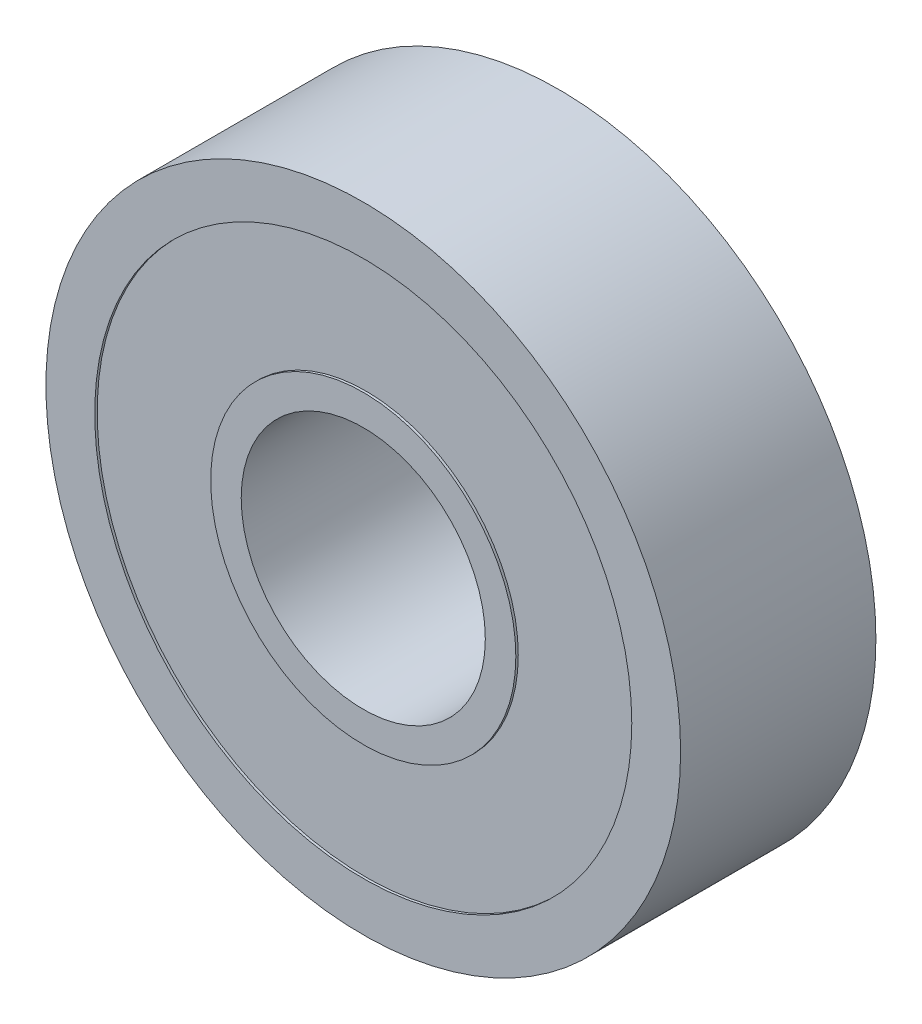
ISO-10303-21;
HEADER;
FILE_DESCRIPTION(('STEP AP214'),'2;1');
FILE_NAME('part.step','',(''),(''),'','','');
FILE_SCHEMA(('AUTOMOTIVE_DESIGN { 1 0 10303 214 1 1 1 1 }'));
ENDSEC;
DATA;
#1=APPLICATION_CONTEXT('core data for automotive mechanical design processes');
#2=APPLICATION_PROTOCOL_DEFINITION('international standard','automotive_design',2000,#1);
#3=PRODUCT_CONTEXT('',#1,'mechanical');
#4=PRODUCT('Part','Part','',(#3));
#5=PRODUCT_RELATED_PRODUCT_CATEGORY('part','',(#4));
#6=PRODUCT_DEFINITION_FORMATION('','',#4);
#7=PRODUCT_DEFINITION_CONTEXT('part definition',#1,'design');
#8=PRODUCT_DEFINITION('design','',#6,#7);
#9=PRODUCT_DEFINITION_SHAPE('','',#8);
#10=(LENGTH_UNIT() NAMED_UNIT(*) SI_UNIT(.MILLI.,.METRE.));
#11=(NAMED_UNIT(*) PLANE_ANGLE_UNIT() SI_UNIT($,.RADIAN.));
#12=(NAMED_UNIT(*) SI_UNIT($,.STERADIAN.) SOLID_ANGLE_UNIT());
#13=UNCERTAINTY_MEASURE_WITH_UNIT(LENGTH_MEASURE(1.E-05),#10,'distance_accuracy_value','');
#14=(GEOMETRIC_REPRESENTATION_CONTEXT(3) GLOBAL_UNCERTAINTY_ASSIGNED_CONTEXT((#13)) GLOBAL_UNIT_ASSIGNED_CONTEXT((#10,
#11,#12)) REPRESENTATION_CONTEXT('',''));
#15=CARTESIAN_POINT('',(0.,0.,0.));
#16=DIRECTION('',(0.,0.,1.));
#17=DIRECTION('',(1.,0.,0.));
#18=AXIS2_PLACEMENT_3D('',#15,#16,#17);
#19=CARTESIAN_POINT('',(0.,0.,0.));
#20=DIRECTION('',(0.,0.,1.));
#21=DIRECTION('',(1.,0.,0.));
#22=AXIS2_PLACEMENT_3D('',#19,#20,#21);
#23=PLANE('',#22);
#24=CARTESIAN_POINT('',(0.,0.,0.));
#25=DIRECTION('',(0.,0.,1.));
#26=DIRECTION('',(1.,0.,0.));
#27=AXIS2_PLACEMENT_3D('',#24,#25,#26);
#28=CIRCLE('',#27,5.);
#29=CARTESIAN_POINT('',(5.,0.,0.));
#30=VERTEX_POINT('',#29);
#31=EDGE_CURVE('E52',#30,#30,#28,.T.);
#32=ORIENTED_EDGE('',*,*,#31,.T.);
#33=EDGE_LOOP('',(#32));
#34=FACE_BOUND('',#33,.T.);
#35=CARTESIAN_POINT('',(0.,0.,0.));
#36=DIRECTION('',(0.,0.,-1.));
#37=DIRECTION('',(-1.,0.,0.));
#38=AXIS2_PLACEMENT_3D('',#35,#36,#37);
#39=CIRCLE('',#38,6.25);
#40=CARTESIAN_POINT('',(-6.25,0.,0.));
#41=VERTEX_POINT('',#40);
#42=EDGE_CURVE('E84',#41,#41,#39,.T.);
#43=ORIENTED_EDGE('',*,*,#42,.T.);
#44=EDGE_LOOP('',(#43));
#45=FACE_BOUND('',#44,.T.);
#46=ADVANCED_FACE('F37',(#34,#45),#23,.F.);
#47=CARTESIAN_POINT('',(0.,0.,8.));
#48=DIRECTION('',(0.,0.,1.));
#49=DIRECTION('',(1.,0.,0.));
#50=AXIS2_PLACEMENT_3D('',#47,#48,#49);
#51=PLANE('',#50);
#52=CARTESIAN_POINT('',(0.,0.,8.));
#53=DIRECTION('',(0.,0.,1.));
#54=DIRECTION('',(1.,0.,0.));
#55=AXIS2_PLACEMENT_3D('',#52,#53,#54);
#56=CIRCLE('',#55,5.);
#57=CARTESIAN_POINT('',(5.,0.,8.));
#58=VERTEX_POINT('',#57);
#59=EDGE_CURVE('E50',#58,#58,#56,.T.);
#60=ORIENTED_EDGE('',*,*,#59,.F.);
#61=EDGE_LOOP('',(#60));
#62=FACE_BOUND('',#61,.T.);
#63=CARTESIAN_POINT('',(0.,0.,8.));
#64=DIRECTION('',(0.,0.,1.));
#65=DIRECTION('',(1.,0.,0.));
#66=AXIS2_PLACEMENT_3D('',#63,#64,#65);
#67=CIRCLE('',#66,6.25);
#68=CARTESIAN_POINT('',(6.25,0.,8.));
#69=VERTEX_POINT('',#68);
#70=EDGE_CURVE('E68',#69,#69,#67,.T.);
#71=ORIENTED_EDGE('',*,*,#70,.T.);
#72=EDGE_LOOP('',(#71));
#73=FACE_BOUND('',#72,.T.);
#74=ADVANCED_FACE('F124',(#62,#73),#51,.T.);
#75=CARTESIAN_POINT('',(0.,0.,8.));
#76=DIRECTION('',(0.,0.,1.));
#77=DIRECTION('',(1.,0.,0.));
#78=AXIS2_PLACEMENT_3D('',#75,#76,#77);
#79=CIRCLE('',#78,11.);
#80=CARTESIAN_POINT('',(11.,0.,8.));
#81=VERTEX_POINT('',#80);
#82=EDGE_CURVE('E60',#81,#81,#79,.T.);
#83=ORIENTED_EDGE('',*,*,#82,.F.);
#84=EDGE_LOOP('',(#83));
#85=FACE_BOUND('',#84,.T.);
#86=CARTESIAN_POINT('',(0.,0.,8.));
#87=DIRECTION('',(0.,0.,1.));
#88=DIRECTION('',(1.,0.,0.));
#89=AXIS2_PLACEMENT_3D('',#86,#87,#88);
#90=CIRCLE('',#89,13.);
#91=CARTESIAN_POINT('',(13.,0.,8.));
#92=VERTEX_POINT('',#91);
#93=EDGE_CURVE('E10',#92,#92,#90,.T.);
#94=ORIENTED_EDGE('',*,*,#93,.T.);
#95=EDGE_LOOP('',(#94));
#96=FACE_BOUND('',#95,.T.);
#97=ADVANCED_FACE('F111',(#85,#96),#51,.T.);
#98=CARTESIAN_POINT('',(0.,0.,0.));
#99=DIRECTION('',(0.,0.,-1.));
#100=DIRECTION('',(-1.,0.,0.));
#101=AXIS2_PLACEMENT_3D('',#98,#99,#100);
#102=CIRCLE('',#101,11.);
#103=CARTESIAN_POINT('',(-11.,0.,0.));
#104=VERTEX_POINT('',#103);
#105=EDGE_CURVE('E76',#104,#104,#102,.T.);
#106=ORIENTED_EDGE('',*,*,#105,.F.);
#107=EDGE_LOOP('',(#106));
#108=FACE_BOUND('',#107,.T.);
#109=CARTESIAN_POINT('',(0.,0.,0.));
#110=DIRECTION('',(0.,0.,1.));
#111=DIRECTION('',(1.,0.,0.));
#112=AXIS2_PLACEMENT_3D('',#109,#110,#111);
#113=CIRCLE('',#112,13.);
#114=CARTESIAN_POINT('',(13.,0.,0.));
#115=VERTEX_POINT('',#114);
#116=EDGE_CURVE('E41',#115,#115,#113,.T.);
#117=ORIENTED_EDGE('',*,*,#116,.F.);
#118=EDGE_LOOP('',(#117));
#119=FACE_BOUND('',#118,.T.);
#120=ADVANCED_FACE('F108',(#108,#119),#23,.F.);
#121=CARTESIAN_POINT('',(0.,0.,8.));
#122=DIRECTION('',(0.,0.,-1.));
#123=DIRECTION('',(-1.,0.,0.));
#124=AXIS2_PLACEMENT_3D('',#121,#122,#123);
#125=CYLINDRICAL_SURFACE('',#124,13.);
#126=ORIENTED_EDGE('',*,*,#93,.F.);
#127=EDGE_LOOP('',(#126));
#128=FACE_BOUND('',#127,.T.);
#129=ORIENTED_EDGE('',*,*,#116,.T.);
#130=EDGE_LOOP('',(#129));
#131=FACE_BOUND('',#130,.T.);
#132=ADVANCED_FACE('F39',(#128,#131),#125,.T.);
#133=CARTESIAN_POINT('',(0.,0.,8.));
#134=DIRECTION('',(0.,0.,-1.));
#135=DIRECTION('',(-1.,0.,0.));
#136=AXIS2_PLACEMENT_3D('',#133,#134,#135);
#137=CYLINDRICAL_SURFACE('',#136,5.);
#138=ORIENTED_EDGE('',*,*,#59,.T.);
#139=EDGE_LOOP('',(#138));
#140=FACE_BOUND('',#139,.T.);
#141=ORIENTED_EDGE('',*,*,#31,.F.);
#142=EDGE_LOOP('',(#141));
#143=FACE_BOUND('',#142,.T.);
#144=ADVANCED_FACE('F115',(#140,#143),#137,.F.);
#145=CARTESIAN_POINT('',(0.,0.,7.9));
#146=DIRECTION('',(0.,0.,1.));
#147=DIRECTION('',(1.,0.,0.));
#148=AXIS2_PLACEMENT_3D('',#145,#146,#147);
#149=CYLINDRICAL_SURFACE('',#148,11.);
#150=CARTESIAN_POINT('',(0.,0.,7.9));
#151=DIRECTION('',(0.,0.,1.));
#152=DIRECTION('',(1.,0.,0.));
#153=AXIS2_PLACEMENT_3D('',#150,#151,#152);
#154=CIRCLE('',#153,11.);
#155=CARTESIAN_POINT('',(11.,0.,7.9));
#156=VERTEX_POINT('',#155);
#157=EDGE_CURVE('E56',#156,#156,#154,.T.);
#158=ORIENTED_EDGE('',*,*,#157,.F.);
#159=EDGE_LOOP('',(#158));
#160=FACE_BOUND('',#159,.T.);
#161=ORIENTED_EDGE('',*,*,#82,.T.);
#162=EDGE_LOOP('',(#161));
#163=FACE_BOUND('',#162,.T.);
#164=ADVANCED_FACE('F120',(#160,#163),#149,.F.);
#165=CARTESIAN_POINT('',(0.,0.,7.9));
#166=DIRECTION('',(0.,0.,1.));
#167=DIRECTION('',(1.,0.,0.));
#168=AXIS2_PLACEMENT_3D('',#165,#166,#167);
#169=PLANE('',#168);
#170=CARTESIAN_POINT('',(0.,0.,7.9));
#171=DIRECTION('',(0.,0.,1.));
#172=DIRECTION('',(1.,0.,0.));
#173=AXIS2_PLACEMENT_3D('',#170,#171,#172);
#174=CIRCLE('',#173,6.25);
#175=CARTESIAN_POINT('',(6.25,0.,7.9));
#176=VERTEX_POINT('',#175);
#177=EDGE_CURVE('E64',#176,#176,#174,.T.);
#178=ORIENTED_EDGE('',*,*,#177,.F.);
#179=EDGE_LOOP('',(#178));
#180=FACE_BOUND('',#179,.T.);
#181=ORIENTED_EDGE('',*,*,#157,.T.);
#182=EDGE_LOOP('',(#181));
#183=FACE_BOUND('',#182,.T.);
#184=ADVANCED_FACE('F137',(#180,#183),#169,.T.);
#185=CARTESIAN_POINT('',(0.,0.,7.9));
#186=DIRECTION('',(0.,0.,1.));
#187=DIRECTION('',(1.,0.,0.));
#188=AXIS2_PLACEMENT_3D('',#185,#186,#187);
#189=CYLINDRICAL_SURFACE('',#188,6.25);
#190=ORIENTED_EDGE('',*,*,#177,.T.);
#191=EDGE_LOOP('',(#190));
#192=FACE_BOUND('',#191,.T.);
#193=ORIENTED_EDGE('',*,*,#70,.F.);
#194=EDGE_LOOP('',(#193));
#195=FACE_BOUND('',#194,.T.);
#196=ADVANCED_FACE('F104',(#192,#195),#189,.T.);
#197=CARTESIAN_POINT('',(0.,0.,0.1));
#198=DIRECTION('',(0.,0.,-1.));
#199=DIRECTION('',(-1.,0.,0.));
#200=AXIS2_PLACEMENT_3D('',#197,#198,#199);
#201=CYLINDRICAL_SURFACE('',#200,11.);
#202=CARTESIAN_POINT('',(0.,0.,0.1));
#203=DIRECTION('',(0.,0.,-1.));
#204=DIRECTION('',(-1.,0.,0.));
#205=AXIS2_PLACEMENT_3D('',#202,#203,#204);
#206=CIRCLE('',#205,11.);
#207=CARTESIAN_POINT('',(-11.,0.,0.1));
#208=VERTEX_POINT('',#207);
#209=EDGE_CURVE('E72',#208,#208,#206,.T.);
#210=ORIENTED_EDGE('',*,*,#209,.F.);
#211=EDGE_LOOP('',(#210));
#212=FACE_BOUND('',#211,.T.);
#213=ORIENTED_EDGE('',*,*,#105,.T.);
#214=EDGE_LOOP('',(#213));
#215=FACE_BOUND('',#214,.T.);
#216=ADVANCED_FACE('F98',(#212,#215),#201,.F.);
#217=CARTESIAN_POINT('',(0.,0.,0.1));
#218=DIRECTION('',(0.,0.,-1.));
#219=DIRECTION('',(-1.,0.,0.));
#220=AXIS2_PLACEMENT_3D('',#217,#218,#219);
#221=PLANE('',#220);
#222=CARTESIAN_POINT('',(0.,0.,0.1));
#223=DIRECTION('',(0.,0.,-1.));
#224=DIRECTION('',(-1.,0.,0.));
#225=AXIS2_PLACEMENT_3D('',#222,#223,#224);
#226=CIRCLE('',#225,6.25);
#227=CARTESIAN_POINT('',(-6.25,0.,0.1));
#228=VERTEX_POINT('',#227);
#229=EDGE_CURVE('E80',#228,#228,#226,.T.);
#230=ORIENTED_EDGE('',*,*,#229,.F.);
#231=EDGE_LOOP('',(#230));
#232=FACE_BOUND('',#231,.T.);
#233=ORIENTED_EDGE('',*,*,#209,.T.);
#234=EDGE_LOOP('',(#233));
#235=FACE_BOUND('',#234,.T.);
#236=ADVANCED_FACE('F95',(#232,#235),#221,.T.);
#237=CARTESIAN_POINT('',(0.,0.,0.1));
#238=DIRECTION('',(0.,0.,-1.));
#239=DIRECTION('',(-1.,0.,0.));
#240=AXIS2_PLACEMENT_3D('',#237,#238,#239);
#241=CYLINDRICAL_SURFACE('',#240,6.25);
#242=ORIENTED_EDGE('',*,*,#229,.T.);
#243=EDGE_LOOP('',(#242));
#244=FACE_BOUND('',#243,.T.);
#245=ORIENTED_EDGE('',*,*,#42,.F.);
#246=EDGE_LOOP('',(#245));
#247=FACE_BOUND('',#246,.T.);
#248=ADVANCED_FACE('F92',(#244,#247),#241,.T.);
#249=CLOSED_SHELL('',(#46,#74,#97,#120,#132,#144,#164,#184,#196,#216,#236,#248));
#250=MANIFOLD_SOLID_BREP('B2',#249);
#251=ADVANCED_BREP_SHAPE_REPRESENTATION('',(#18,#250),#14);
#252=SHAPE_DEFINITION_REPRESENTATION(#9,#251);
ENDSEC;
END-ISO-10303-21;
